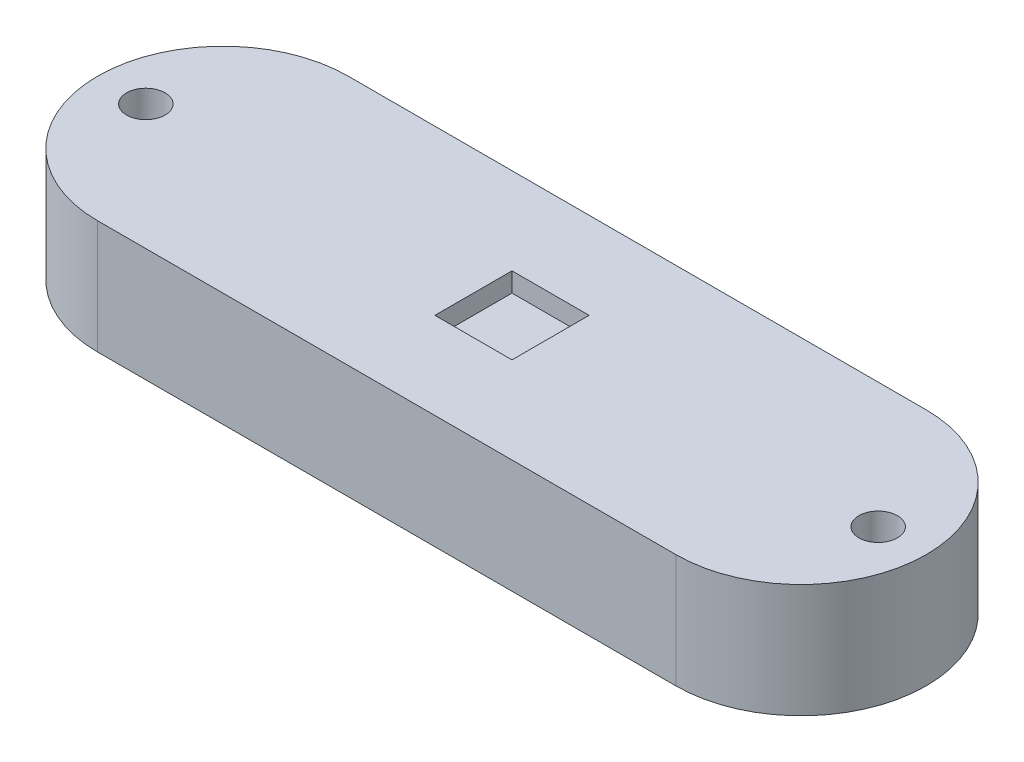
ISO-10303-21;
HEADER;
FILE_DESCRIPTION(('STEP AP214'),'2;1');
FILE_NAME('part.step','',(''),(''),'','','');
FILE_SCHEMA(('AUTOMOTIVE_DESIGN { 1 0 10303 214 1 1 1 1 }'));
ENDSEC;
DATA;
#1=APPLICATION_CONTEXT('core data for automotive mechanical design processes');
#2=APPLICATION_PROTOCOL_DEFINITION('international standard','automotive_design',2000,#1);
#3=PRODUCT_CONTEXT('',#1,'mechanical');
#4=PRODUCT('Part','Part','',(#3));
#5=PRODUCT_RELATED_PRODUCT_CATEGORY('part','',(#4));
#6=PRODUCT_DEFINITION_FORMATION('','',#4);
#7=PRODUCT_DEFINITION_CONTEXT('part definition',#1,'design');
#8=PRODUCT_DEFINITION('design','',#6,#7);
#9=PRODUCT_DEFINITION_SHAPE('','',#8);
#10=(LENGTH_UNIT() NAMED_UNIT(*) SI_UNIT(.MILLI.,.METRE.));
#11=(NAMED_UNIT(*) PLANE_ANGLE_UNIT() SI_UNIT($,.RADIAN.));
#12=(NAMED_UNIT(*) SI_UNIT($,.STERADIAN.) SOLID_ANGLE_UNIT());
#13=UNCERTAINTY_MEASURE_WITH_UNIT(LENGTH_MEASURE(1.E-05),#10,'distance_accuracy_value','');
#14=(GEOMETRIC_REPRESENTATION_CONTEXT(3) GLOBAL_UNCERTAINTY_ASSIGNED_CONTEXT((#13)) GLOBAL_UNIT_ASSIGNED_CONTEXT((#10,
#11,#12)) REPRESENTATION_CONTEXT('',''));
#15=CARTESIAN_POINT('',(0.,0.,0.));
#16=DIRECTION('',(0.,0.,1.));
#17=DIRECTION('',(1.,0.,0.));
#18=AXIS2_PLACEMENT_3D('',#15,#16,#17);
#19=CARTESIAN_POINT('',(-15.,0.,0.));
#20=DIRECTION('',(0.,1.,0.));
#21=DIRECTION('',(0.,0.,1.));
#22=AXIS2_PLACEMENT_3D('',#19,#20,#21);
#23=PLANE('',#22);
#24=CARTESIAN_POINT('',(-15.,0.,0.));
#25=DIRECTION('',(0.,1.,0.));
#26=DIRECTION('',(0.,0.,1.));
#27=AXIS2_PLACEMENT_3D('',#24,#25,#26);
#28=CIRCLE('',#27,6.5);
#29=CARTESIAN_POINT('',(-15.,0.,-6.5));
#30=VERTEX_POINT('',#29);
#31=CARTESIAN_POINT('',(-15.,0.,6.5));
#32=VERTEX_POINT('',#31);
#33=EDGE_CURVE('E214',#30,#32,#28,.T.);
#34=ORIENTED_EDGE('',*,*,#33,.F.);
#35=DIRECTION('',(-1.,0.,0.));
#36=VECTOR('',#35,1.);
#37=CARTESIAN_POINT('',(-15.,0.,-6.5));
#38=LINE('',#37,#36);
#39=CARTESIAN_POINT('',(15.,0.,-6.5));
#40=VERTEX_POINT('',#39);
#41=EDGE_CURVE('E231',#40,#30,#38,.T.);
#42=ORIENTED_EDGE('',*,*,#41,.F.);
#43=CARTESIAN_POINT('',(15.,0.,0.));
#44=DIRECTION('',(0.,1.,0.));
#45=DIRECTION('',(0.,0.,1.));
#46=AXIS2_PLACEMENT_3D('',#43,#44,#45);
#47=CIRCLE('',#46,6.5);
#48=CARTESIAN_POINT('',(15.,0.,6.5));
#49=VERTEX_POINT('',#48);
#50=EDGE_CURVE('E247',#49,#40,#47,.T.);
#51=ORIENTED_EDGE('',*,*,#50,.F.);
#52=DIRECTION('',(1.,0.,0.));
#53=VECTOR('',#52,1.);
#54=CARTESIAN_POINT('',(-15.,0.,6.5));
#55=LINE('',#54,#53);
#56=EDGE_CURVE('E244',#32,#49,#55,.T.);
#57=ORIENTED_EDGE('',*,*,#56,.F.);
#58=EDGE_LOOP('',(#34,#42,#51,#57));
#59=FACE_BOUND('',#58,.T.);
#60=CARTESIAN_POINT('',(19.,0.,0.));
#61=DIRECTION('',(0.,1.,0.));
#62=DIRECTION('',(0.,0.,1.));
#63=AXIS2_PLACEMENT_3D('',#60,#61,#62);
#64=CIRCLE('',#63,1.);
#65=CARTESIAN_POINT('',(19.,0.,0.999999999999995));
#66=VERTEX_POINT('',#65);
#67=EDGE_CURVE('E200',#66,#66,#64,.T.);
#68=ORIENTED_EDGE('',*,*,#67,.T.);
#69=EDGE_LOOP('',(#68));
#70=FACE_BOUND('',#69,.T.);
#71=CARTESIAN_POINT('',(-19.,0.,0.));
#72=DIRECTION('',(0.,1.,0.));
#73=DIRECTION('',(0.,0.,1.));
#74=AXIS2_PLACEMENT_3D('',#71,#72,#73);
#75=CIRCLE('',#74,1.);
#76=CARTESIAN_POINT('',(-19.,0.,1.));
#77=VERTEX_POINT('',#76);
#78=EDGE_CURVE('E210',#77,#77,#75,.T.);
#79=ORIENTED_EDGE('',*,*,#78,.T.);
#80=EDGE_LOOP('',(#79));
#81=FACE_BOUND('',#80,.T.);
#82=DIRECTION('',(0.,0.,1.));
#83=VECTOR('',#82,1.);
#84=CARTESIAN_POINT('',(13.9346230895756,0.,-2.28055385101598));
#85=LINE('',#84,#83);
#86=CARTESIAN_POINT('',(13.9346230895756,0.,-2.28055385101598));
#87=VERTEX_POINT('',#86);
#88=CARTESIAN_POINT('',(13.9346230895756,0.,2.71944614898402));
#89=VERTEX_POINT('',#88);
#90=EDGE_CURVE('E157',#87,#89,#85,.T.);
#91=ORIENTED_EDGE('',*,*,#90,.F.);
#92=DIRECTION('',(1.,0.,0.));
#93=VECTOR('',#92,1.);
#94=CARTESIAN_POINT('',(5.93462308957564,0.,-2.28055385101598));
#95=LINE('',#94,#93);
#96=CARTESIAN_POINT('',(5.93462308957564,0.,-2.28055385101598));
#97=VERTEX_POINT('',#96);
#98=EDGE_CURVE('E154',#97,#87,#95,.T.);
#99=ORIENTED_EDGE('',*,*,#98,.F.);
#100=DIRECTION('',(0.,0.,-1.));
#101=VECTOR('',#100,1.);
#102=CARTESIAN_POINT('',(5.93462308957564,0.,-2.28055385101598));
#103=LINE('',#102,#101);
#104=CARTESIAN_POINT('',(5.93462308957564,0.,2.71944614898402));
#105=VERTEX_POINT('',#104);
#106=EDGE_CURVE('E66',#105,#97,#103,.T.);
#107=ORIENTED_EDGE('',*,*,#106,.F.);
#108=DIRECTION('',(-1.,0.,0.));
#109=VECTOR('',#108,1.);
#110=CARTESIAN_POINT('',(5.93462308957564,0.,2.71944614898402));
#111=LINE('',#110,#109);
#112=EDGE_CURVE('E61',#89,#105,#111,.T.);
#113=ORIENTED_EDGE('',*,*,#112,.F.);
#114=EDGE_LOOP('',(#91,#99,#107,#113));
#115=FACE_BOUND('',#114,.T.);
#116=ADVANCED_FACE('F45',(#59,#70,#81,#115),#23,.F.);
#117=CARTESIAN_POINT('',(-15.,5.9,0.));
#118=DIRECTION('',(0.,-1.,0.));
#119=DIRECTION('',(0.,0.,-1.));
#120=AXIS2_PLACEMENT_3D('',#117,#118,#119);
#121=CYLINDRICAL_SURFACE('',#120,6.5);
#122=ORIENTED_EDGE('',*,*,#33,.T.);
#123=DIRECTION('',(0.,-1.,0.));
#124=VECTOR('',#123,1.);
#125=CARTESIAN_POINT('',(-15.,5.9,6.5));
#126=LINE('',#125,#124);
#127=CARTESIAN_POINT('',(-15.,5.9,6.5));
#128=VERTEX_POINT('',#127);
#129=EDGE_CURVE('E11',#128,#32,#126,.T.);
#130=ORIENTED_EDGE('',*,*,#129,.F.);
#131=CARTESIAN_POINT('',(-15.,5.9,0.));
#132=DIRECTION('',(0.,1.,0.));
#133=DIRECTION('',(0.,0.,1.));
#134=AXIS2_PLACEMENT_3D('',#131,#132,#133);
#135=CIRCLE('',#134,6.5);
#136=CARTESIAN_POINT('',(-15.,5.9,-6.5));
#137=VERTEX_POINT('',#136);
#138=EDGE_CURVE('E226',#137,#128,#135,.T.);
#139=ORIENTED_EDGE('',*,*,#138,.F.);
#140=DIRECTION('',(0.,-1.,0.));
#141=VECTOR('',#140,1.);
#142=CARTESIAN_POINT('',(-15.,5.9,-6.5));
#143=LINE('',#142,#141);
#144=EDGE_CURVE('E240',#137,#30,#143,.T.);
#145=ORIENTED_EDGE('',*,*,#144,.T.);
#146=EDGE_LOOP('',(#122,#130,#139,#145));
#147=FACE_BOUND('',#146,.T.);
#148=ADVANCED_FACE('F47',(#147),#121,.T.);
#149=CARTESIAN_POINT('',(-15.,5.9,6.5));
#150=DIRECTION('',(0.,0.,-1.));
#151=DIRECTION('',(-1.,0.,0.));
#152=AXIS2_PLACEMENT_3D('',#149,#150,#151);
#153=PLANE('',#152);
#154=ORIENTED_EDGE('',*,*,#56,.T.);
#155=DIRECTION('',(0.,-1.,0.));
#156=VECTOR('',#155,1.);
#157=CARTESIAN_POINT('',(15.,5.9,6.5));
#158=LINE('',#157,#156);
#159=CARTESIAN_POINT('',(15.,5.9,6.5));
#160=VERTEX_POINT('',#159);
#161=EDGE_CURVE('E54',#160,#49,#158,.T.);
#162=ORIENTED_EDGE('',*,*,#161,.F.);
#163=DIRECTION('',(1.,0.,0.));
#164=VECTOR('',#163,1.);
#165=CARTESIAN_POINT('',(-15.,5.9,6.5));
#166=LINE('',#165,#164);
#167=EDGE_CURVE('E230',#128,#160,#166,.T.);
#168=ORIENTED_EDGE('',*,*,#167,.F.);
#169=ORIENTED_EDGE('',*,*,#129,.T.);
#170=EDGE_LOOP('',(#154,#162,#168,#169));
#171=FACE_BOUND('',#170,.T.);
#172=ADVANCED_FACE('F280',(#171),#153,.F.);
#173=CARTESIAN_POINT('',(15.,5.9,0.));
#174=DIRECTION('',(0.,-1.,0.));
#175=DIRECTION('',(0.,0.,-1.));
#176=AXIS2_PLACEMENT_3D('',#173,#174,#175);
#177=CYLINDRICAL_SURFACE('',#176,6.5);
#178=ORIENTED_EDGE('',*,*,#50,.T.);
#179=DIRECTION('',(0.,-1.,0.));
#180=VECTOR('',#179,1.);
#181=CARTESIAN_POINT('',(15.,5.9,-6.5));
#182=LINE('',#181,#180);
#183=CARTESIAN_POINT('',(15.,5.9,-6.5));
#184=VERTEX_POINT('',#183);
#185=EDGE_CURVE('E255',#184,#40,#182,.T.);
#186=ORIENTED_EDGE('',*,*,#185,.F.);
#187=CARTESIAN_POINT('',(15.,5.9,0.));
#188=DIRECTION('',(0.,1.,0.));
#189=DIRECTION('',(0.,0.,1.));
#190=AXIS2_PLACEMENT_3D('',#187,#188,#189);
#191=CIRCLE('',#190,6.5);
#192=EDGE_CURVE('E234',#160,#184,#191,.T.);
#193=ORIENTED_EDGE('',*,*,#192,.F.);
#194=ORIENTED_EDGE('',*,*,#161,.T.);
#195=EDGE_LOOP('',(#178,#186,#193,#194));
#196=FACE_BOUND('',#195,.T.);
#197=ADVANCED_FACE('F264',(#196),#177,.T.);
#198=CARTESIAN_POINT('',(-15.,5.9,-6.5));
#199=DIRECTION('',(0.,0.,1.));
#200=DIRECTION('',(1.,0.,0.));
#201=AXIS2_PLACEMENT_3D('',#198,#199,#200);
#202=PLANE('',#201);
#203=ORIENTED_EDGE('',*,*,#41,.T.);
#204=ORIENTED_EDGE('',*,*,#144,.F.);
#205=DIRECTION('',(-1.,0.,0.));
#206=VECTOR('',#205,1.);
#207=CARTESIAN_POINT('',(-15.,5.9,-6.5));
#208=LINE('',#207,#206);
#209=EDGE_CURVE('E237',#184,#137,#208,.T.);
#210=ORIENTED_EDGE('',*,*,#209,.F.);
#211=ORIENTED_EDGE('',*,*,#185,.T.);
#212=EDGE_LOOP('',(#203,#204,#210,#211));
#213=FACE_BOUND('',#212,.T.);
#214=ADVANCED_FACE('F273',(#213),#202,.F.);
#215=CARTESIAN_POINT('',(-15.,5.9,0.));
#216=DIRECTION('',(0.,1.,0.));
#217=DIRECTION('',(0.,0.,1.));
#218=AXIS2_PLACEMENT_3D('',#215,#216,#217);
#219=PLANE('',#218);
#220=DIRECTION('',(0.,0.,-1.));
#221=VECTOR('',#220,1.);
#222=CARTESIAN_POINT('',(2.,5.9,2.));
#223=LINE('',#222,#221);
#224=CARTESIAN_POINT('',(2.,5.9,2.));
#225=VERTEX_POINT('',#224);
#226=CARTESIAN_POINT('',(2.,5.9,-2.));
#227=VERTEX_POINT('',#226);
#228=EDGE_CURVE('E159',#225,#227,#223,.T.);
#229=ORIENTED_EDGE('',*,*,#228,.F.);
#230=DIRECTION('',(1.,0.,0.));
#231=VECTOR('',#230,1.);
#232=CARTESIAN_POINT('',(-2.,5.9,2.));
#233=LINE('',#232,#231);
#234=CARTESIAN_POINT('',(-2.,5.9,2.));
#235=VERTEX_POINT('',#234);
#236=EDGE_CURVE('E174',#235,#225,#233,.T.);
#237=ORIENTED_EDGE('',*,*,#236,.F.);
#238=DIRECTION('',(0.,0.,1.));
#239=VECTOR('',#238,1.);
#240=CARTESIAN_POINT('',(-2.,5.9,2.));
#241=LINE('',#240,#239);
#242=CARTESIAN_POINT('',(-2.,5.9,-2.));
#243=VERTEX_POINT('',#242);
#244=EDGE_CURVE('E190',#243,#235,#241,.T.);
#245=ORIENTED_EDGE('',*,*,#244,.F.);
#246=DIRECTION('',(-1.,0.,0.));
#247=VECTOR('',#246,1.);
#248=CARTESIAN_POINT('',(-2.,5.9,-2.));
#249=LINE('',#248,#247);
#250=EDGE_CURVE('E163',#227,#243,#249,.T.);
#251=ORIENTED_EDGE('',*,*,#250,.F.);
#252=EDGE_LOOP('',(#229,#237,#245,#251));
#253=FACE_BOUND('',#252,.T.);
#254=CARTESIAN_POINT('',(-19.,5.9,0.));
#255=DIRECTION('',(0.,1.,0.));
#256=DIRECTION('',(0.,0.,1.));
#257=AXIS2_PLACEMENT_3D('',#254,#255,#256);
#258=CIRCLE('',#257,1.);
#259=CARTESIAN_POINT('',(-19.,5.9,1.));
#260=VERTEX_POINT('',#259);
#261=EDGE_CURVE('E215',#260,#260,#258,.T.);
#262=ORIENTED_EDGE('',*,*,#261,.F.);
#263=EDGE_LOOP('',(#262));
#264=FACE_BOUND('',#263,.T.);
#265=CARTESIAN_POINT('',(19.,5.9,0.));
#266=DIRECTION('',(0.,1.,0.));
#267=DIRECTION('',(0.,0.,1.));
#268=AXIS2_PLACEMENT_3D('',#265,#266,#267);
#269=CIRCLE('',#268,1.);
#270=CARTESIAN_POINT('',(19.,5.9,0.999999999999995));
#271=VERTEX_POINT('',#270);
#272=EDGE_CURVE('E219',#271,#271,#269,.T.);
#273=ORIENTED_EDGE('',*,*,#272,.F.);
#274=EDGE_LOOP('',(#273));
#275=FACE_BOUND('',#274,.T.);
#276=ORIENTED_EDGE('',*,*,#138,.T.);
#277=ORIENTED_EDGE('',*,*,#167,.T.);
#278=ORIENTED_EDGE('',*,*,#192,.T.);
#279=ORIENTED_EDGE('',*,*,#209,.T.);
#280=EDGE_LOOP('',(#276,#277,#278,#279));
#281=FACE_BOUND('',#280,.T.);
#282=ADVANCED_FACE('F279',(#253,#264,#275,#281),#219,.T.);
#283=CARTESIAN_POINT('',(19.,0.,0.));
#284=DIRECTION('',(0.,1.,0.));
#285=DIRECTION('',(0.,0.,1.));
#286=AXIS2_PLACEMENT_3D('',#283,#284,#285);
#287=CYLINDRICAL_SURFACE('',#286,1.);
#288=ORIENTED_EDGE('',*,*,#67,.F.);
#289=EDGE_LOOP('',(#288));
#290=FACE_BOUND('',#289,.T.);
#291=ORIENTED_EDGE('',*,*,#272,.T.);
#292=EDGE_LOOP('',(#291));
#293=FACE_BOUND('',#292,.T.);
#294=ADVANCED_FACE('F301',(#290,#293),#287,.F.);
#295=CARTESIAN_POINT('',(-19.,0.,0.));
#296=DIRECTION('',(0.,1.,0.));
#297=DIRECTION('',(0.,0.,1.));
#298=AXIS2_PLACEMENT_3D('',#295,#296,#297);
#299=CYLINDRICAL_SURFACE('',#298,1.);
#300=ORIENTED_EDGE('',*,*,#78,.F.);
#301=EDGE_LOOP('',(#300));
#302=FACE_BOUND('',#301,.T.);
#303=ORIENTED_EDGE('',*,*,#261,.T.);
#304=EDGE_LOOP('',(#303));
#305=FACE_BOUND('',#304,.T.);
#306=ADVANCED_FACE('F307',(#302,#305),#299,.F.);
#307=CARTESIAN_POINT('',(2.,4.9,2.));
#308=DIRECTION('',(1.,0.,0.));
#309=DIRECTION('',(0.,0.,-1.));
#310=AXIS2_PLACEMENT_3D('',#307,#308,#309);
#311=PLANE('',#310);
#312=ORIENTED_EDGE('',*,*,#228,.T.);
#313=DIRECTION('',(0.,1.,0.));
#314=VECTOR('',#313,1.);
#315=CARTESIAN_POINT('',(2.,4.9,-2.));
#316=LINE('',#315,#314);
#317=CARTESIAN_POINT('',(2.,4.9,-2.));
#318=VERTEX_POINT('',#317);
#319=EDGE_CURVE('E185',#318,#227,#316,.T.);
#320=ORIENTED_EDGE('',*,*,#319,.F.);
#321=DIRECTION('',(0.,0.,-1.));
#322=VECTOR('',#321,1.);
#323=CARTESIAN_POINT('',(2.,4.9,2.));
#324=LINE('',#323,#322);
#325=CARTESIAN_POINT('',(2.,4.9,2.));
#326=VERTEX_POINT('',#325);
#327=EDGE_CURVE('E169',#326,#318,#324,.T.);
#328=ORIENTED_EDGE('',*,*,#327,.F.);
#329=DIRECTION('',(0.,1.,0.));
#330=VECTOR('',#329,1.);
#331=CARTESIAN_POINT('',(2.,4.9,2.));
#332=LINE('',#331,#330);
#333=EDGE_CURVE('E197',#326,#225,#332,.T.);
#334=ORIENTED_EDGE('',*,*,#333,.T.);
#335=EDGE_LOOP('',(#312,#320,#328,#334));
#336=FACE_BOUND('',#335,.T.);
#337=ADVANCED_FACE('F318',(#336),#311,.F.);
#338=CARTESIAN_POINT('',(-2.,4.9,2.));
#339=DIRECTION('',(0.,0.,1.));
#340=DIRECTION('',(1.,0.,0.));
#341=AXIS2_PLACEMENT_3D('',#338,#339,#340);
#342=PLANE('',#341);
#343=ORIENTED_EDGE('',*,*,#236,.T.);
#344=ORIENTED_EDGE('',*,*,#333,.F.);
#345=DIRECTION('',(1.,0.,0.));
#346=VECTOR('',#345,1.);
#347=CARTESIAN_POINT('',(-2.,4.9,2.));
#348=LINE('',#347,#346);
#349=CARTESIAN_POINT('',(-2.,4.9,2.));
#350=VERTEX_POINT('',#349);
#351=EDGE_CURVE('E182',#350,#326,#348,.T.);
#352=ORIENTED_EDGE('',*,*,#351,.F.);
#353=DIRECTION('',(0.,1.,0.));
#354=VECTOR('',#353,1.);
#355=CARTESIAN_POINT('',(-2.,4.9,2.));
#356=LINE('',#355,#354);
#357=EDGE_CURVE('E201',#350,#235,#356,.T.);
#358=ORIENTED_EDGE('',*,*,#357,.T.);
#359=EDGE_LOOP('',(#343,#344,#352,#358));
#360=FACE_BOUND('',#359,.T.);
#361=ADVANCED_FACE('F323',(#360),#342,.F.);
#362=CARTESIAN_POINT('',(-2.,4.9,2.));
#363=DIRECTION('',(-1.,0.,0.));
#364=DIRECTION('',(0.,0.,1.));
#365=AXIS2_PLACEMENT_3D('',#362,#363,#364);
#366=PLANE('',#365);
#367=ORIENTED_EDGE('',*,*,#244,.T.);
#368=ORIENTED_EDGE('',*,*,#357,.F.);
#369=DIRECTION('',(0.,0.,1.));
#370=VECTOR('',#369,1.);
#371=CARTESIAN_POINT('',(-2.,4.9,2.));
#372=LINE('',#371,#370);
#373=CARTESIAN_POINT('',(-2.,4.9,-2.));
#374=VERTEX_POINT('',#373);
#375=EDGE_CURVE('E178',#374,#350,#372,.T.);
#376=ORIENTED_EDGE('',*,*,#375,.F.);
#377=DIRECTION('',(0.,1.,0.));
#378=VECTOR('',#377,1.);
#379=CARTESIAN_POINT('',(-2.,4.9,-2.));
#380=LINE('',#379,#378);
#381=EDGE_CURVE('E204',#374,#243,#380,.T.);
#382=ORIENTED_EDGE('',*,*,#381,.T.);
#383=EDGE_LOOP('',(#367,#368,#376,#382));
#384=FACE_BOUND('',#383,.T.);
#385=ADVANCED_FACE('F332',(#384),#366,.F.);
#386=CARTESIAN_POINT('',(-2.,4.9,-2.));
#387=DIRECTION('',(0.,0.,-1.));
#388=DIRECTION('',(-1.,0.,0.));
#389=AXIS2_PLACEMENT_3D('',#386,#387,#388);
#390=PLANE('',#389);
#391=ORIENTED_EDGE('',*,*,#250,.T.);
#392=ORIENTED_EDGE('',*,*,#381,.F.);
#393=DIRECTION('',(-1.,0.,0.));
#394=VECTOR('',#393,1.);
#395=CARTESIAN_POINT('',(-2.,4.9,-2.));
#396=LINE('',#395,#394);
#397=EDGE_CURVE('E173',#318,#374,#396,.T.);
#398=ORIENTED_EDGE('',*,*,#397,.F.);
#399=ORIENTED_EDGE('',*,*,#319,.T.);
#400=EDGE_LOOP('',(#391,#392,#398,#399));
#401=FACE_BOUND('',#400,.T.);
#402=ADVANCED_FACE('F328',(#401),#390,.F.);
#403=CARTESIAN_POINT('',(0.,4.9,0.));
#404=DIRECTION('',(0.,-1.,0.));
#405=DIRECTION('',(0.,0.,-1.));
#406=AXIS2_PLACEMENT_3D('',#403,#404,#405);
#407=PLANE('',#406);
#408=ORIENTED_EDGE('',*,*,#327,.T.);
#409=ORIENTED_EDGE('',*,*,#397,.T.);
#410=ORIENTED_EDGE('',*,*,#375,.T.);
#411=ORIENTED_EDGE('',*,*,#351,.T.);
#412=EDGE_LOOP('',(#408,#409,#410,#411));
#413=FACE_BOUND('',#412,.T.);
#414=ADVANCED_FACE('F331',(#413),#407,.F.);
#415=CARTESIAN_POINT('',(13.9346230895756,-1.95,-2.28055385101598));
#416=DIRECTION('',(-1.,0.,0.));
#417=DIRECTION('',(0.,0.,1.));
#418=AXIS2_PLACEMENT_3D('',#415,#416,#417);
#419=PLANE('',#418);
#420=ORIENTED_EDGE('',*,*,#90,.T.);
#421=DIRECTION('',(0.,1.,0.));
#422=VECTOR('',#421,1.);
#423=CARTESIAN_POINT('',(13.9346230895756,-1.95,2.71944614898402));
#424=LINE('',#423,#422);
#425=CARTESIAN_POINT('',(13.9346230895756,-1.95,2.71944614898402));
#426=VERTEX_POINT('',#425);
#427=EDGE_CURVE('E136',#426,#89,#424,.T.);
#428=ORIENTED_EDGE('',*,*,#427,.F.);
#429=DIRECTION('',(0.,0.,1.));
#430=VECTOR('',#429,1.);
#431=CARTESIAN_POINT('',(13.9346230895756,-1.95,-2.28055385101598));
#432=LINE('',#431,#430);
#433=CARTESIAN_POINT('',(13.9346230895756,-1.95,-2.28055385101598));
#434=VERTEX_POINT('',#433);
#435=EDGE_CURVE('E144',#434,#426,#432,.T.);
#436=ORIENTED_EDGE('',*,*,#435,.F.);
#437=DIRECTION('',(0.,1.,0.));
#438=VECTOR('',#437,1.);
#439=CARTESIAN_POINT('',(13.9346230895756,-1.95,-2.28055385101598));
#440=LINE('',#439,#438);
#441=EDGE_CURVE('E454',#434,#87,#440,.T.);
#442=ORIENTED_EDGE('',*,*,#441,.T.);
#443=EDGE_LOOP('',(#420,#428,#436,#442));
#444=FACE_BOUND('',#443,.T.);
#445=ADVANCED_FACE('F156',(#444),#419,.F.);
#446=CARTESIAN_POINT('',(5.93462308957564,-1.95,2.71944614898402));
#447=DIRECTION('',(0.,0.,-1.));
#448=DIRECTION('',(-1.,0.,0.));
#449=AXIS2_PLACEMENT_3D('',#446,#447,#448);
#450=PLANE('',#449);
#451=ORIENTED_EDGE('',*,*,#112,.T.);
#452=DIRECTION('',(0.,1.,0.));
#453=VECTOR('',#452,1.);
#454=CARTESIAN_POINT('',(5.93462308957564,-1.95,2.71944614898402));
#455=LINE('',#454,#453);
#456=CARTESIAN_POINT('',(5.93462308957564,-1.95,2.71944614898402));
#457=VERTEX_POINT('',#456);
#458=EDGE_CURVE('E139',#457,#105,#455,.T.);
#459=ORIENTED_EDGE('',*,*,#458,.F.);
#460=DIRECTION('',(-1.,0.,0.));
#461=VECTOR('',#460,1.);
#462=CARTESIAN_POINT('',(5.93462308957564,-1.95,2.71944614898402));
#463=LINE('',#462,#461);
#464=EDGE_CURVE('E132',#426,#457,#463,.T.);
#465=ORIENTED_EDGE('',*,*,#464,.F.);
#466=ORIENTED_EDGE('',*,*,#427,.T.);
#467=EDGE_LOOP('',(#451,#459,#465,#466));
#468=FACE_BOUND('',#467,.T.);
#469=ADVANCED_FACE('F134',(#468),#450,.F.);
#470=CARTESIAN_POINT('',(5.93462308957564,-1.95,-2.28055385101598));
#471=DIRECTION('',(1.,0.,0.));
#472=DIRECTION('',(0.,0.,-1.));
#473=AXIS2_PLACEMENT_3D('',#470,#471,#472);
#474=PLANE('',#473);
#475=ORIENTED_EDGE('',*,*,#106,.T.);
#476=DIRECTION('',(0.,1.,0.));
#477=VECTOR('',#476,1.);
#478=CARTESIAN_POINT('',(5.93462308957564,-1.95,-2.28055385101598));
#479=LINE('',#478,#477);
#480=CARTESIAN_POINT('',(5.93462308957564,-1.95,-2.28055385101598));
#481=VERTEX_POINT('',#480);
#482=EDGE_CURVE('E165',#481,#97,#479,.T.);
#483=ORIENTED_EDGE('',*,*,#482,.F.);
#484=DIRECTION('',(0.,0.,-1.));
#485=VECTOR('',#484,1.);
#486=CARTESIAN_POINT('',(5.93462308957564,-1.95,-2.28055385101598));
#487=LINE('',#486,#485);
#488=EDGE_CURVE('E143',#457,#481,#487,.T.);
#489=ORIENTED_EDGE('',*,*,#488,.F.);
#490=ORIENTED_EDGE('',*,*,#458,.T.);
#491=EDGE_LOOP('',(#475,#483,#489,#490));
#492=FACE_BOUND('',#491,.T.);
#493=ADVANCED_FACE('F345',(#492),#474,.F.);
#494=CARTESIAN_POINT('',(5.93462308957564,-1.95,-2.28055385101598));
#495=DIRECTION('',(0.,0.,1.));
#496=DIRECTION('',(1.,0.,0.));
#497=AXIS2_PLACEMENT_3D('',#494,#495,#496);
#498=PLANE('',#497);
#499=ORIENTED_EDGE('',*,*,#98,.T.);
#500=ORIENTED_EDGE('',*,*,#441,.F.);
#501=DIRECTION('',(1.,0.,0.));
#502=VECTOR('',#501,1.);
#503=CARTESIAN_POINT('',(5.93462308957564,-1.95,-2.28055385101598));
#504=LINE('',#503,#502);
#505=EDGE_CURVE('E149',#481,#434,#504,.T.);
#506=ORIENTED_EDGE('',*,*,#505,.F.);
#507=ORIENTED_EDGE('',*,*,#482,.T.);
#508=EDGE_LOOP('',(#499,#500,#506,#507));
#509=FACE_BOUND('',#508,.T.);
#510=ADVANCED_FACE('F348',(#509),#498,.F.);
#511=CARTESIAN_POINT('',(0.,-1.95,0.));
#512=DIRECTION('',(0.,1.,0.));
#513=DIRECTION('',(0.,0.,1.));
#514=AXIS2_PLACEMENT_3D('',#511,#512,#513);
#515=PLANE('',#514);
#516=ORIENTED_EDGE('',*,*,#435,.T.);
#517=ORIENTED_EDGE('',*,*,#464,.T.);
#518=ORIENTED_EDGE('',*,*,#488,.T.);
#519=ORIENTED_EDGE('',*,*,#505,.T.);
#520=EDGE_LOOP('',(#516,#517,#518,#519));
#521=FACE_BOUND('',#520,.T.);
#522=ADVANCED_FACE('F147',(#521),#515,.F.);
#523=CLOSED_SHELL('',(#116,#148,#172,#197,#214,#282,#294,#306,#337,#361,#385,#402,#414,#445,
#469,#493,#510,#522));
#524=MANIFOLD_SOLID_BREP('B2',#523);
#525=ADVANCED_BREP_SHAPE_REPRESENTATION('',(#18,#524),#14);
#526=SHAPE_DEFINITION_REPRESENTATION(#9,#525);
ENDSEC;
END-ISO-10303-21;
